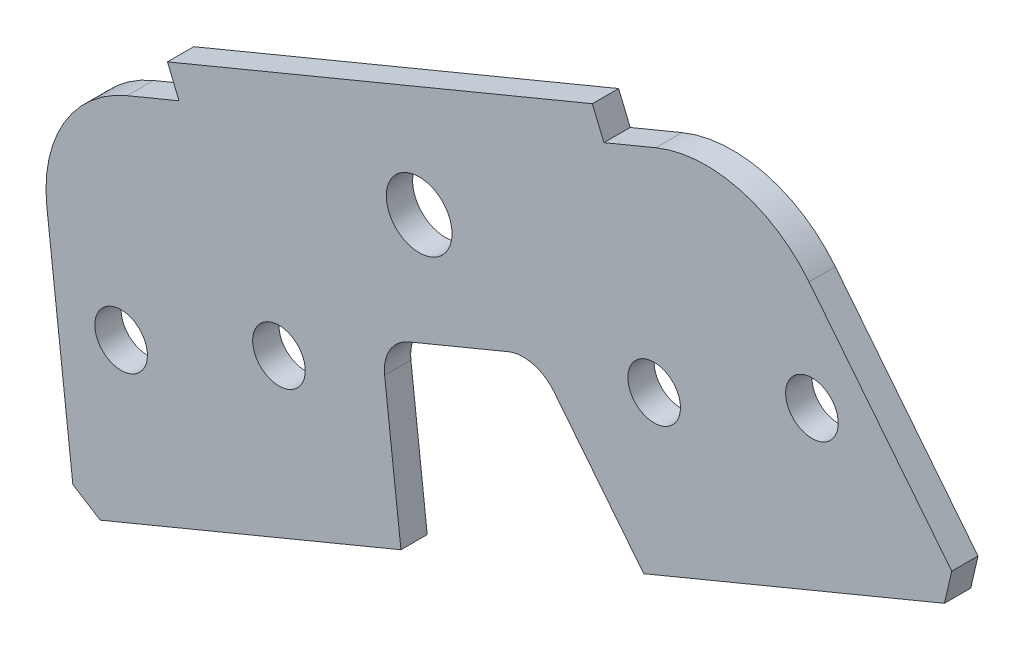
ISO-10303-21;
HEADER;
FILE_DESCRIPTION(('STEP AP214'),'2;1');
FILE_NAME('part.step','',(''),(''),'','','');
FILE_SCHEMA(('AUTOMOTIVE_DESIGN { 1 0 10303 214 1 1 1 1 }'));
ENDSEC;
DATA;
#1=APPLICATION_CONTEXT('core data for automotive mechanical design processes');
#2=APPLICATION_PROTOCOL_DEFINITION('international standard','automotive_design',2000,#1);
#3=PRODUCT_CONTEXT('',#1,'mechanical');
#4=PRODUCT('Part','Part','',(#3));
#5=PRODUCT_RELATED_PRODUCT_CATEGORY('part','',(#4));
#6=PRODUCT_DEFINITION_FORMATION('','',#4);
#7=PRODUCT_DEFINITION_CONTEXT('part definition',#1,'design');
#8=PRODUCT_DEFINITION('design','',#6,#7);
#9=PRODUCT_DEFINITION_SHAPE('','',#8);
#10=(LENGTH_UNIT() NAMED_UNIT(*) SI_UNIT(.MILLI.,.METRE.));
#11=(NAMED_UNIT(*) PLANE_ANGLE_UNIT() SI_UNIT($,.RADIAN.));
#12=(NAMED_UNIT(*) SI_UNIT($,.STERADIAN.) SOLID_ANGLE_UNIT());
#13=UNCERTAINTY_MEASURE_WITH_UNIT(LENGTH_MEASURE(1.E-05),#10,'distance_accuracy_value','');
#14=(GEOMETRIC_REPRESENTATION_CONTEXT(3) GLOBAL_UNCERTAINTY_ASSIGNED_CONTEXT((#13)) GLOBAL_UNIT_ASSIGNED_CONTEXT((#10,
#11,#12)) REPRESENTATION_CONTEXT('',''));
#15=CARTESIAN_POINT('',(0.,0.,0.));
#16=DIRECTION('',(0.,0.,1.));
#17=DIRECTION('',(1.,0.,0.));
#18=AXIS2_PLACEMENT_3D('',#15,#16,#17);
#19=CARTESIAN_POINT('',(0.,0.,0.));
#20=DIRECTION('',(0.,0.,1.));
#21=DIRECTION('',(1.,0.,0.));
#22=AXIS2_PLACEMENT_3D('',#19,#20,#21);
#23=PLANE('',#22);
#24=CARTESIAN_POINT('',(9.15052963955277,-2.4701754289237,0.));
#25=DIRECTION('',(0.,0.,1.));
#26=DIRECTION('',(1.,0.,0.));
#27=AXIS2_PLACEMENT_3D('',#24,#25,#26);
#28=CIRCLE('',#27,2.5);
#29=CARTESIAN_POINT('',(11.6505296395528,-2.4701754289237,0.));
#30=VERTEX_POINT('',#29);
#31=EDGE_CURVE('E339',#30,#30,#28,.T.);
#32=ORIENTED_EDGE('',*,*,#31,.T.);
#33=EDGE_LOOP('',(#32));
#34=FACE_BOUND('',#33,.T.);
#35=CARTESIAN_POINT('',(-1.51848160016179,-17.0846394614182,0.));
#36=DIRECTION('',(0.,0.,1.));
#37=DIRECTION('',(1.,0.,0.));
#38=AXIS2_PLACEMENT_3D('',#35,#36,#37);
#39=CIRCLE('',#38,2.);
#40=CARTESIAN_POINT('',(0.481518399838207,-17.0846394614182,0.));
#41=VERTEX_POINT('',#40);
#42=EDGE_CURVE('E322',#41,#41,#39,.T.);
#43=ORIENTED_EDGE('',*,*,#42,.T.);
#44=EDGE_LOOP('',(#43));
#45=FACE_BOUND('',#44,.T.);
#46=CARTESIAN_POINT('',(27.0308489094612,-5.24588121239051,0.));
#47=DIRECTION('',(0.,0.,1.));
#48=DIRECTION('',(1.,0.,0.));
#49=AXIS2_PLACEMENT_3D('',#46,#47,#48);
#50=CIRCLE('',#49,2.);
#51=CARTESIAN_POINT('',(29.0308489094612,-5.24588121239051,0.));
#52=VERTEX_POINT('',#51);
#53=EDGE_CURVE('E332',#52,#52,#50,.T.);
#54=ORIENTED_EDGE('',*,*,#53,.T.);
#55=EDGE_LOOP('',(#54));
#56=FACE_BOUND('',#55,.T.);
#57=CARTESIAN_POINT('',(39.039313186973,-0.266244107568475,0.));
#58=DIRECTION('',(0.,0.,1.));
#59=DIRECTION('',(1.,0.,0.));
#60=AXIS2_PLACEMENT_3D('',#57,#58,#59);
#61=CIRCLE('',#60,2.);
#62=CARTESIAN_POINT('',(41.039313186973,-0.266244107568475,0.));
#63=VERTEX_POINT('',#62);
#64=EDGE_CURVE('E231',#63,#63,#61,.T.);
#65=ORIENTED_EDGE('',*,*,#64,.T.);
#66=EDGE_LOOP('',(#65));
#67=FACE_BOUND('',#66,.T.);
#68=CARTESIAN_POINT('',(-13.5269458776737,-22.0642765662403,0.));
#69=DIRECTION('',(0.,0.,1.));
#70=DIRECTION('',(1.,0.,0.));
#71=AXIS2_PLACEMENT_3D('',#68,#69,#70);
#72=CIRCLE('',#71,2.);
#73=CARTESIAN_POINT('',(-11.5269458776737,-22.0642765662403,0.));
#74=VERTEX_POINT('',#73);
#75=EDGE_CURVE('E321',#74,#74,#72,.T.);
#76=ORIENTED_EDGE('',*,*,#75,.T.);
#77=EDGE_LOOP('',(#76));
#78=FACE_BOUND('',#77,.T.);
#79=DIRECTION('',(-0.113596389820193,0.993526980116705,0.));
#80=VECTOR('',#79,1.);
#81=CARTESIAN_POINT('',(7.76575409137843,-25.237089947171,0.));
#82=LINE('',#81,#80);
#83=CARTESIAN_POINT('',(7.76575409137843,-25.237089947171,0.));
#84=VERTEX_POINT('',#83);
#85=CARTESIAN_POINT('',(6.52174404513419,-14.3568362134367,0.));
#86=VERTEX_POINT('',#85);
#87=EDGE_CURVE('E61',#84,#86,#82,.T.);
#88=ORIENTED_EDGE('',*,*,#87,.F.);
#89=DIRECTION('',(0.923728021347068,0.383049008063238,0.));
#90=VECTOR('',#89,1.);
#91=CARTESIAN_POINT('',(-15.1143740140115,-34.7249588572736,0.));
#92=LINE('',#91,#90);
#93=CARTESIAN_POINT('',(-15.1143740140115,-34.7249588572736,0.));
#94=VERTEX_POINT('',#93);
#95=EDGE_CURVE('E224',#94,#84,#92,.T.);
#96=ORIENTED_EDGE('',*,*,#95,.F.);
#97=DIRECTION('',(0.848244236286053,-0.529605245071734,0.));
#98=VECTOR('',#97,1.);
#99=CARTESIAN_POINT('',(-17.1981785771974,-33.4239257595427,0.));
#100=LINE('',#99,#98);
#101=CARTESIAN_POINT('',(-17.1981785771974,-33.4239257595427,0.));
#102=VERTEX_POINT('',#101);
#103=EDGE_CURVE('E221',#102,#94,#100,.T.);
#104=ORIENTED_EDGE('',*,*,#103,.F.);
#105=DIRECTION('',(0.113596389820181,-0.993526980116706,0.));
#106=VECTOR('',#105,1.);
#107=CARTESIAN_POINT('',(-19.1783506268372,-16.1051151907874,0.));
#108=LINE('',#107,#106);
#109=CARTESIAN_POINT('',(-19.1783506268372,-16.1051151907874,0.));
#110=VERTEX_POINT('',#109);
#111=EDGE_CURVE('E218',#110,#102,#108,.T.);
#112=ORIENTED_EDGE('',*,*,#111,.F.);
#113=CARTESIAN_POINT('',(-9.24308082567015,-14.9691512925857,0.));
#114=DIRECTION('',(0.,0.,1.));
#115=DIRECTION('',(1.,0.,0.));
#116=AXIS2_PLACEMENT_3D('',#113,#114,#115);
#117=CIRCLE('',#116,10.);
#118=CARTESIAN_POINT('',(-13.0735709063025,-5.73187107911496,0.));
#119=VERTEX_POINT('',#118);
#120=EDGE_CURVE('E215',#119,#110,#117,.T.);
#121=ORIENTED_EDGE('',*,*,#120,.F.);
#122=DIRECTION('',(-0.923728021347069,-0.383049008063236,0.));
#123=VECTOR('',#122,1.);
#124=CARTESIAN_POINT('',(-9.12148027836872,-4.09302895262147,0.));
#125=LINE('',#124,#123);
#126=CARTESIAN_POINT('',(-9.12148027836872,-4.09302895262147,0.));
#127=VERTEX_POINT('',#126);
#128=EDGE_CURVE('E212',#127,#119,#125,.T.);
#129=ORIENTED_EDGE('',*,*,#128,.F.);
#130=DIRECTION('',(0.383049008063239,-0.923728021347068,0.));
#131=VECTOR('',#130,1.);
#132=CARTESIAN_POINT('',(-10.0024929969142,-1.96845450352322,0.));
#133=LINE('',#132,#131);
#134=CARTESIAN_POINT('',(-10.0024929969142,-1.96845450352322,0.));
#135=VERTEX_POINT('',#134);
#136=EDGE_CURVE('E209',#135,#127,#133,.T.);
#137=ORIENTED_EDGE('',*,*,#136,.F.);
#138=DIRECTION('',(-0.923728021347068,-0.383049008063238,0.));
#139=VECTOR('',#138,1.);
#140=CARTESIAN_POINT('',(22.3279877502332,11.4382607786901,0.));
#141=LINE('',#140,#139);
#142=CARTESIAN_POINT('',(22.3279877502332,11.4382607786901,0.));
#143=VERTEX_POINT('',#142);
#144=EDGE_CURVE('E206',#143,#135,#141,.T.);
#145=ORIENTED_EDGE('',*,*,#144,.F.);
#146=DIRECTION('',(-0.383049008063237,0.923728021347069,0.));
#147=VECTOR('',#146,1.);
#148=CARTESIAN_POINT('',(23.2090004687787,9.31368632959184,0.));
#149=LINE('',#148,#147);
#150=CARTESIAN_POINT('',(23.2090004687787,9.31368632959184,0.));
#151=VERTEX_POINT('',#150);
#152=EDGE_CURVE('E203',#151,#143,#149,.T.);
#153=ORIENTED_EDGE('',*,*,#152,.F.);
#154=DIRECTION('',(-0.923728021347067,-0.38304900806324,0.));
#155=VECTOR('',#154,1.);
#156=CARTESIAN_POINT('',(27.1610910967124,10.9525284560853,0.));
#157=LINE('',#156,#155);
#158=CARTESIAN_POINT('',(27.1610910967124,10.9525284560853,0.));
#159=VERTEX_POINT('',#158);
#160=EDGE_CURVE('E200',#159,#151,#157,.T.);
#161=ORIENTED_EDGE('',*,*,#160,.F.);
#162=CARTESIAN_POINT('',(30.9915811773447,1.71524824261463,0.));
#163=DIRECTION('',(0.,0.,1.));
#164=DIRECTION('',(1.,0.,0.));
#165=AXIS2_PLACEMENT_3D('',#162,#163,#164);
#166=CIRCLE('',#165,10.);
#167=CARTESIAN_POINT('',(38.8151986638943,7.94349112677999,0.));
#168=VERTEX_POINT('',#167);
#169=EDGE_CURVE('E197',#168,#159,#166,.T.);
#170=ORIENTED_EDGE('',*,*,#169,.F.);
#171=DIRECTION('',(-0.622824288416537,0.782361748654952,0.));
#172=VECTOR('',#171,1.);
#173=CARTESIAN_POINT('',(49.6720511546426,-5.69436188814628,0.));
#174=LINE('',#173,#172);
#175=CARTESIAN_POINT('',(49.6720511546426,-5.69436188814628,0.));
#176=VERTEX_POINT('',#175);
#177=EDGE_CURVE('E194',#176,#168,#174,.T.);
#178=ORIENTED_EDGE('',*,*,#177,.F.);
#179=DIRECTION('',(0.224540614468517,0.974464731252035,0.));
#180=VECTOR('',#179,1.);
#181=CARTESIAN_POINT('',(49.1204426237097,-8.08824087580364,0.));
#182=LINE('',#181,#180);
#183=CARTESIAN_POINT('',(49.1204426237097,-8.08824087580364,0.));
#184=VERTEX_POINT('',#183);
#185=EDGE_CURVE('E191',#184,#176,#182,.T.);
#186=ORIENTED_EDGE('',*,*,#185,.F.);
#187=DIRECTION('',(0.923728021347068,0.383049008063238,0.));
#188=VECTOR('',#187,1.);
#189=CARTESIAN_POINT('',(26.2403145183198,-17.5761097859062,0.));
#190=LINE('',#189,#188);
#191=CARTESIAN_POINT('',(26.2403145183198,-17.5761097859062,0.));
#192=VERTEX_POINT('',#191);
#193=EDGE_CURVE('E185',#192,#184,#190,.T.);
#194=ORIENTED_EDGE('',*,*,#193,.F.);
#195=DIRECTION('',(0.622824288416526,-0.782361748654961,0.));
#196=VECTOR('',#195,1.);
#197=CARTESIAN_POINT('',(19.419678113752,-9.00835620971839,0.));
#198=LINE('',#197,#196);
#199=CARTESIAN_POINT('',(19.419678113752,-9.00835620971839,0.));
#200=VERTEX_POINT('',#199);
#201=EDGE_CURVE('E183',#200,#192,#198,.T.);
#202=ORIENTED_EDGE('',*,*,#201,.F.);
#203=CARTESIAN_POINT('',(17.0725928677871,-10.876829074968,0.));
#204=DIRECTION('',(0.,0.,-1.));
#205=DIRECTION('',(1.,0.,0.));
#206=AXIS2_PLACEMENT_3D('',#203,#204,#205);
#207=CIRCLE('',#206,3.);
#208=CARTESIAN_POINT('',(15.9234458435974,-8.10564501092676,0.));
#209=VERTEX_POINT('',#208);
#210=EDGE_CURVE('E166',#209,#200,#207,.T.);
#211=ORIENTED_EDGE('',*,*,#210,.F.);
#212=DIRECTION('',(0.923728021347068,0.383049008063238,0.));
#213=VECTOR('',#212,1.);
#214=CARTESIAN_POINT('',(8.3531779612946,-11.2448629799349,0.));
#215=LINE('',#214,#213);
#216=CARTESIAN_POINT('',(8.3531779612946,-11.2448629799349,0.));
#217=VERTEX_POINT('',#216);
#218=EDGE_CURVE('E174',#217,#209,#215,.T.);
#219=ORIENTED_EDGE('',*,*,#218,.F.);
#220=CARTESIAN_POINT('',(9.5023249854843,-14.0160470439761,0.));
#221=DIRECTION('',(0.,0.,-1.));
#222=DIRECTION('',(1.,0.,0.));
#223=AXIS2_PLACEMENT_3D('',#220,#221,#222);
#224=CIRCLE('',#223,3.);
#225=EDGE_CURVE('E179',#86,#217,#224,.T.);
#226=ORIENTED_EDGE('',*,*,#225,.F.);
#227=EDGE_LOOP('',(#88,#96,#104,#112,#121,#129,#137,#145,#153,#161,#170,#178,#186,#194,#202,
#211,#219,#226));
#228=FACE_BOUND('',#227,.T.);
#229=ADVANCED_FACE('F37',(#34,#45,#56,#67,#78,#228),#23,.F.);
#230=CARTESIAN_POINT('',(7.76575409137843,-25.237089947171,0.));
#231=DIRECTION('',(0.993526980116705,0.113596389820193,0.));
#232=DIRECTION('',(-0.113596389820193,0.993526980116705,0.));
#233=AXIS2_PLACEMENT_3D('',#230,#231,#232);
#234=PLANE('',#233);
#235=DIRECTION('',(-0.113596389820193,0.993526980116705,0.));
#236=VECTOR('',#235,1.);
#237=CARTESIAN_POINT('',(7.76575409137843,-25.237089947171,2.));
#238=LINE('',#237,#236);
#239=CARTESIAN_POINT('',(7.76575409137843,-25.237089947171,2.));
#240=VERTEX_POINT('',#239);
#241=CARTESIAN_POINT('',(6.52174404513419,-14.3568362134367,2.));
#242=VERTEX_POINT('',#241);
#243=EDGE_CURVE('E227',#240,#242,#238,.T.);
#244=ORIENTED_EDGE('',*,*,#243,.F.);
#245=DIRECTION('',(0.,0.,1.));
#246=VECTOR('',#245,1.);
#247=CARTESIAN_POINT('',(7.76575409137843,-25.237089947171,0.));
#248=LINE('',#247,#246);
#249=EDGE_CURVE('E12',#84,#240,#248,.T.);
#250=ORIENTED_EDGE('',*,*,#249,.F.);
#251=ORIENTED_EDGE('',*,*,#87,.T.);
#252=DIRECTION('',(0.,0.,1.));
#253=VECTOR('',#252,1.);
#254=CARTESIAN_POINT('',(6.52174404513418,-14.3568362134367,0.));
#255=LINE('',#254,#253);
#256=EDGE_CURVE('E40',#86,#242,#255,.T.);
#257=ORIENTED_EDGE('',*,*,#256,.T.);
#258=EDGE_LOOP('',(#244,#250,#251,#257));
#259=FACE_BOUND('',#258,.T.);
#260=ADVANCED_FACE('F306',(#259),#234,.T.);
#261=CARTESIAN_POINT('',(-15.1143740140115,-34.7249588572736,0.));
#262=DIRECTION('',(0.383049008063238,-0.923728021347068,0.));
#263=DIRECTION('',(0.923728021347068,0.383049008063238,0.));
#264=AXIS2_PLACEMENT_3D('',#261,#262,#263);
#265=PLANE('',#264);
#266=DIRECTION('',(0.923728021347068,0.383049008063238,0.));
#267=VECTOR('',#266,1.);
#268=CARTESIAN_POINT('',(-15.1143740140115,-34.7249588572736,2.));
#269=LINE('',#268,#267);
#270=CARTESIAN_POINT('',(-15.1143740140115,-34.7249588572736,2.));
#271=VERTEX_POINT('',#270);
#272=EDGE_CURVE('E275',#271,#240,#269,.T.);
#273=ORIENTED_EDGE('',*,*,#272,.F.);
#274=DIRECTION('',(0.,0.,1.));
#275=VECTOR('',#274,1.);
#276=CARTESIAN_POINT('',(-15.1143740140115,-34.7249588572736,0.));
#277=LINE('',#276,#275);
#278=EDGE_CURVE('E45',#94,#271,#277,.T.);
#279=ORIENTED_EDGE('',*,*,#278,.F.);
#280=ORIENTED_EDGE('',*,*,#95,.T.);
#281=ORIENTED_EDGE('',*,*,#249,.T.);
#282=EDGE_LOOP('',(#273,#279,#280,#281));
#283=FACE_BOUND('',#282,.T.);
#284=ADVANCED_FACE('F313',(#283),#265,.T.);
#285=CARTESIAN_POINT('',(-17.1981785771974,-33.4239257595427,0.));
#286=DIRECTION('',(-0.529605245071734,-0.848244236286053,0.));
#287=DIRECTION('',(0.848244236286053,-0.529605245071734,0.));
#288=AXIS2_PLACEMENT_3D('',#285,#286,#287);
#289=PLANE('',#288);
#290=DIRECTION('',(0.848244236286053,-0.529605245071734,0.));
#291=VECTOR('',#290,1.);
#292=CARTESIAN_POINT('',(-17.1981785771974,-33.4239257595427,2.));
#293=LINE('',#292,#291);
#294=CARTESIAN_POINT('',(-17.1981785771974,-33.4239257595427,2.));
#295=VERTEX_POINT('',#294);
#296=EDGE_CURVE('E272',#295,#271,#293,.T.);
#297=ORIENTED_EDGE('',*,*,#296,.F.);
#298=DIRECTION('',(0.,0.,1.));
#299=VECTOR('',#298,1.);
#300=CARTESIAN_POINT('',(-17.1981785771974,-33.4239257595427,0.));
#301=LINE('',#300,#299);
#302=EDGE_CURVE('E279',#102,#295,#301,.T.);
#303=ORIENTED_EDGE('',*,*,#302,.F.);
#304=ORIENTED_EDGE('',*,*,#103,.T.);
#305=ORIENTED_EDGE('',*,*,#278,.T.);
#306=EDGE_LOOP('',(#297,#303,#304,#305));
#307=FACE_BOUND('',#306,.T.);
#308=ADVANCED_FACE('F536',(#307),#289,.T.);
#309=CARTESIAN_POINT('',(-19.1783506268372,-16.1051151907874,0.));
#310=DIRECTION('',(-0.993526980116706,-0.113596389820181,0.));
#311=DIRECTION('',(0.113596389820181,-0.993526980116706,0.));
#312=AXIS2_PLACEMENT_3D('',#309,#310,#311);
#313=PLANE('',#312);
#314=DIRECTION('',(0.113596389820181,-0.993526980116706,0.));
#315=VECTOR('',#314,1.);
#316=CARTESIAN_POINT('',(-19.1783506268372,-16.1051151907874,2.));
#317=LINE('',#316,#315);
#318=CARTESIAN_POINT('',(-19.1783506268372,-16.1051151907874,2.));
#319=VERTEX_POINT('',#318);
#320=EDGE_CURVE('E269',#319,#295,#317,.T.);
#321=ORIENTED_EDGE('',*,*,#320,.F.);
#322=DIRECTION('',(0.,0.,1.));
#323=VECTOR('',#322,1.);
#324=CARTESIAN_POINT('',(-19.1783506268372,-16.1051151907874,0.));
#325=LINE('',#324,#323);
#326=EDGE_CURVE('E281',#110,#319,#325,.T.);
#327=ORIENTED_EDGE('',*,*,#326,.F.);
#328=ORIENTED_EDGE('',*,*,#111,.T.);
#329=ORIENTED_EDGE('',*,*,#302,.T.);
#330=EDGE_LOOP('',(#321,#327,#328,#329));
#331=FACE_BOUND('',#330,.T.);
#332=ADVANCED_FACE('F528',(#331),#313,.T.);
#333=CARTESIAN_POINT('',(-9.24308082567015,-14.9691512925857,0.));
#334=DIRECTION('',(0.,0.,1.));
#335=DIRECTION('',(1.,0.,0.));
#336=AXIS2_PLACEMENT_3D('',#333,#334,#335);
#337=CYLINDRICAL_SURFACE('',#336,10.);
#338=CARTESIAN_POINT('',(-9.24308082567015,-14.9691512925857,2.));
#339=DIRECTION('',(0.,0.,1.));
#340=DIRECTION('',(1.,0.,0.));
#341=AXIS2_PLACEMENT_3D('',#338,#339,#340);
#342=CIRCLE('',#341,10.);
#343=CARTESIAN_POINT('',(-13.0735709063025,-5.73187107911496,2.));
#344=VERTEX_POINT('',#343);
#345=EDGE_CURVE('E266',#344,#319,#342,.T.);
#346=ORIENTED_EDGE('',*,*,#345,.F.);
#347=DIRECTION('',(0.,0.,1.));
#348=VECTOR('',#347,1.);
#349=CARTESIAN_POINT('',(-13.0735709063025,-5.73187107911496,0.));
#350=LINE('',#349,#348);
#351=EDGE_CURVE('E283',#119,#344,#350,.T.);
#352=ORIENTED_EDGE('',*,*,#351,.F.);
#353=ORIENTED_EDGE('',*,*,#120,.T.);
#354=ORIENTED_EDGE('',*,*,#326,.T.);
#355=EDGE_LOOP('',(#346,#352,#353,#354));
#356=FACE_BOUND('',#355,.T.);
#357=ADVANCED_FACE('F520',(#356),#337,.T.);
#358=CARTESIAN_POINT('',(-9.12148027836872,-4.09302895262147,0.));
#359=DIRECTION('',(-0.383049008063236,0.923728021347069,0.));
#360=DIRECTION('',(-0.923728021347069,-0.383049008063236,0.));
#361=AXIS2_PLACEMENT_3D('',#358,#359,#360);
#362=PLANE('',#361);
#363=DIRECTION('',(-0.923728021347069,-0.383049008063236,0.));
#364=VECTOR('',#363,1.);
#365=CARTESIAN_POINT('',(-9.12148027836872,-4.09302895262147,2.));
#366=LINE('',#365,#364);
#367=CARTESIAN_POINT('',(-9.12148027836872,-4.09302895262147,2.));
#368=VERTEX_POINT('',#367);
#369=EDGE_CURVE('E263',#368,#344,#366,.T.);
#370=ORIENTED_EDGE('',*,*,#369,.F.);
#371=DIRECTION('',(0.,0.,1.));
#372=VECTOR('',#371,1.);
#373=CARTESIAN_POINT('',(-9.12148027836872,-4.09302895262147,0.));
#374=LINE('',#373,#372);
#375=EDGE_CURVE('E285',#127,#368,#374,.T.);
#376=ORIENTED_EDGE('',*,*,#375,.F.);
#377=ORIENTED_EDGE('',*,*,#128,.T.);
#378=ORIENTED_EDGE('',*,*,#351,.T.);
#379=EDGE_LOOP('',(#370,#376,#377,#378));
#380=FACE_BOUND('',#379,.T.);
#381=ADVANCED_FACE('F512',(#380),#362,.T.);
#382=CARTESIAN_POINT('',(-10.0024929969142,-1.96845450352322,0.));
#383=DIRECTION('',(-0.923728021347068,-0.383049008063239,0.));
#384=DIRECTION('',(0.383049008063239,-0.923728021347068,0.));
#385=AXIS2_PLACEMENT_3D('',#382,#383,#384);
#386=PLANE('',#385);
#387=DIRECTION('',(0.383049008063239,-0.923728021347068,0.));
#388=VECTOR('',#387,1.);
#389=CARTESIAN_POINT('',(-10.0024929969142,-1.96845450352322,2.));
#390=LINE('',#389,#388);
#391=CARTESIAN_POINT('',(-10.0024929969142,-1.96845450352322,2.));
#392=VERTEX_POINT('',#391);
#393=EDGE_CURVE('E260',#392,#368,#390,.T.);
#394=ORIENTED_EDGE('',*,*,#393,.F.);
#395=DIRECTION('',(0.,0.,1.));
#396=VECTOR('',#395,1.);
#397=CARTESIAN_POINT('',(-10.0024929969142,-1.96845450352322,0.));
#398=LINE('',#397,#396);
#399=EDGE_CURVE('E287',#135,#392,#398,.T.);
#400=ORIENTED_EDGE('',*,*,#399,.F.);
#401=ORIENTED_EDGE('',*,*,#136,.T.);
#402=ORIENTED_EDGE('',*,*,#375,.T.);
#403=EDGE_LOOP('',(#394,#400,#401,#402));
#404=FACE_BOUND('',#403,.T.);
#405=ADVANCED_FACE('F504',(#404),#386,.T.);
#406=CARTESIAN_POINT('',(22.3279877502332,11.4382607786901,0.));
#407=DIRECTION('',(-0.383049008063238,0.923728021347068,0.));
#408=DIRECTION('',(-0.923728021347068,-0.383049008063238,0.));
#409=AXIS2_PLACEMENT_3D('',#406,#407,#408);
#410=PLANE('',#409);
#411=DIRECTION('',(-0.923728021347068,-0.383049008063238,0.));
#412=VECTOR('',#411,1.);
#413=CARTESIAN_POINT('',(22.3279877502332,11.4382607786901,2.));
#414=LINE('',#413,#412);
#415=CARTESIAN_POINT('',(22.3279877502332,11.4382607786901,2.));
#416=VERTEX_POINT('',#415);
#417=EDGE_CURVE('E257',#416,#392,#414,.T.);
#418=ORIENTED_EDGE('',*,*,#417,.F.);
#419=DIRECTION('',(0.,0.,1.));
#420=VECTOR('',#419,1.);
#421=CARTESIAN_POINT('',(22.3279877502332,11.4382607786901,0.));
#422=LINE('',#421,#420);
#423=EDGE_CURVE('E289',#143,#416,#422,.T.);
#424=ORIENTED_EDGE('',*,*,#423,.F.);
#425=ORIENTED_EDGE('',*,*,#144,.T.);
#426=ORIENTED_EDGE('',*,*,#399,.T.);
#427=EDGE_LOOP('',(#418,#424,#425,#426));
#428=FACE_BOUND('',#427,.T.);
#429=ADVANCED_FACE('F496',(#428),#410,.T.);
#430=CARTESIAN_POINT('',(23.2090004687787,9.31368632959184,0.));
#431=DIRECTION('',(0.923728021347069,0.383049008063237,0.));
#432=DIRECTION('',(-0.383049008063237,0.923728021347068,0.));
#433=AXIS2_PLACEMENT_3D('',#430,#431,#432);
#434=PLANE('',#433);
#435=DIRECTION('',(-0.383049008063237,0.923728021347069,0.));
#436=VECTOR('',#435,1.);
#437=CARTESIAN_POINT('',(23.2090004687787,9.31368632959184,2.));
#438=LINE('',#437,#436);
#439=CARTESIAN_POINT('',(23.2090004687787,9.31368632959184,2.));
#440=VERTEX_POINT('',#439);
#441=EDGE_CURVE('E254',#440,#416,#438,.T.);
#442=ORIENTED_EDGE('',*,*,#441,.F.);
#443=DIRECTION('',(0.,0.,1.));
#444=VECTOR('',#443,1.);
#445=CARTESIAN_POINT('',(23.2090004687787,9.31368632959184,0.));
#446=LINE('',#445,#444);
#447=EDGE_CURVE('E291',#151,#440,#446,.T.);
#448=ORIENTED_EDGE('',*,*,#447,.F.);
#449=ORIENTED_EDGE('',*,*,#152,.T.);
#450=ORIENTED_EDGE('',*,*,#423,.T.);
#451=EDGE_LOOP('',(#442,#448,#449,#450));
#452=FACE_BOUND('',#451,.T.);
#453=ADVANCED_FACE('F488',(#452),#434,.T.);
#454=CARTESIAN_POINT('',(27.1610910967124,10.9525284560853,0.));
#455=DIRECTION('',(-0.38304900806324,0.923728021347067,0.));
#456=DIRECTION('',(-0.923728021347067,-0.38304900806324,0.));
#457=AXIS2_PLACEMENT_3D('',#454,#455,#456);
#458=PLANE('',#457);
#459=DIRECTION('',(-0.923728021347067,-0.38304900806324,0.));
#460=VECTOR('',#459,1.);
#461=CARTESIAN_POINT('',(27.1610910967124,10.9525284560853,2.));
#462=LINE('',#461,#460);
#463=CARTESIAN_POINT('',(27.1610910967124,10.9525284560853,2.));
#464=VERTEX_POINT('',#463);
#465=EDGE_CURVE('E251',#464,#440,#462,.T.);
#466=ORIENTED_EDGE('',*,*,#465,.F.);
#467=DIRECTION('',(0.,0.,1.));
#468=VECTOR('',#467,1.);
#469=CARTESIAN_POINT('',(27.1610910967124,10.9525284560853,0.));
#470=LINE('',#469,#468);
#471=EDGE_CURVE('E293',#159,#464,#470,.T.);
#472=ORIENTED_EDGE('',*,*,#471,.F.);
#473=ORIENTED_EDGE('',*,*,#160,.T.);
#474=ORIENTED_EDGE('',*,*,#447,.T.);
#475=EDGE_LOOP('',(#466,#472,#473,#474));
#476=FACE_BOUND('',#475,.T.);
#477=ADVANCED_FACE('F480',(#476),#458,.T.);
#478=CARTESIAN_POINT('',(30.9915811773447,1.71524824261463,0.));
#479=DIRECTION('',(0.,0.,1.));
#480=DIRECTION('',(1.,0.,0.));
#481=AXIS2_PLACEMENT_3D('',#478,#479,#480);
#482=CYLINDRICAL_SURFACE('',#481,10.);
#483=CARTESIAN_POINT('',(30.9915811773447,1.71524824261463,2.));
#484=DIRECTION('',(0.,0.,1.));
#485=DIRECTION('',(1.,0.,0.));
#486=AXIS2_PLACEMENT_3D('',#483,#484,#485);
#487=CIRCLE('',#486,10.);
#488=CARTESIAN_POINT('',(38.8151986638943,7.94349112677999,2.));
#489=VERTEX_POINT('',#488);
#490=EDGE_CURVE('E248',#489,#464,#487,.T.);
#491=ORIENTED_EDGE('',*,*,#490,.F.);
#492=DIRECTION('',(0.,0.,1.));
#493=VECTOR('',#492,1.);
#494=CARTESIAN_POINT('',(38.8151986638943,7.94349112677999,0.));
#495=LINE('',#494,#493);
#496=EDGE_CURVE('E295',#168,#489,#495,.T.);
#497=ORIENTED_EDGE('',*,*,#496,.F.);
#498=ORIENTED_EDGE('',*,*,#169,.T.);
#499=ORIENTED_EDGE('',*,*,#471,.T.);
#500=EDGE_LOOP('',(#491,#497,#498,#499));
#501=FACE_BOUND('',#500,.T.);
#502=ADVANCED_FACE('F472',(#501),#482,.T.);
#503=CARTESIAN_POINT('',(49.6720511546426,-5.69436188814628,0.));
#504=DIRECTION('',(0.782361748654952,0.622824288416537,0.));
#505=DIRECTION('',(-0.622824288416537,0.782361748654952,0.));
#506=AXIS2_PLACEMENT_3D('',#503,#504,#505);
#507=PLANE('',#506);
#508=DIRECTION('',(-0.622824288416537,0.782361748654952,0.));
#509=VECTOR('',#508,1.);
#510=CARTESIAN_POINT('',(49.6720511546426,-5.69436188814628,2.));
#511=LINE('',#510,#509);
#512=CARTESIAN_POINT('',(49.6720511546426,-5.69436188814628,2.));
#513=VERTEX_POINT('',#512);
#514=EDGE_CURVE('E245',#513,#489,#511,.T.);
#515=ORIENTED_EDGE('',*,*,#514,.F.);
#516=DIRECTION('',(0.,0.,1.));
#517=VECTOR('',#516,1.);
#518=CARTESIAN_POINT('',(49.6720511546426,-5.69436188814628,0.));
#519=LINE('',#518,#517);
#520=EDGE_CURVE('E297',#176,#513,#519,.T.);
#521=ORIENTED_EDGE('',*,*,#520,.F.);
#522=ORIENTED_EDGE('',*,*,#177,.T.);
#523=ORIENTED_EDGE('',*,*,#496,.T.);
#524=EDGE_LOOP('',(#515,#521,#522,#523));
#525=FACE_BOUND('',#524,.T.);
#526=ADVANCED_FACE('F464',(#525),#507,.T.);
#527=CARTESIAN_POINT('',(49.1204426237097,-8.08824087580364,0.));
#528=DIRECTION('',(0.974464731252035,-0.224540614468517,0.));
#529=DIRECTION('',(0.224540614468517,0.974464731252035,0.));
#530=AXIS2_PLACEMENT_3D('',#527,#528,#529);
#531=PLANE('',#530);
#532=DIRECTION('',(0.224540614468517,0.974464731252035,0.));
#533=VECTOR('',#532,1.);
#534=CARTESIAN_POINT('',(49.1204426237097,-8.08824087580364,2.));
#535=LINE('',#534,#533);
#536=CARTESIAN_POINT('',(49.1204426237097,-8.08824087580364,2.));
#537=VERTEX_POINT('',#536);
#538=EDGE_CURVE('E242',#537,#513,#535,.T.);
#539=ORIENTED_EDGE('',*,*,#538,.F.);
#540=DIRECTION('',(0.,0.,1.));
#541=VECTOR('',#540,1.);
#542=CARTESIAN_POINT('',(49.1204426237097,-8.08824087580364,0.));
#543=LINE('',#542,#541);
#544=EDGE_CURVE('E299',#184,#537,#543,.T.);
#545=ORIENTED_EDGE('',*,*,#544,.F.);
#546=ORIENTED_EDGE('',*,*,#185,.T.);
#547=ORIENTED_EDGE('',*,*,#520,.T.);
#548=EDGE_LOOP('',(#539,#545,#546,#547));
#549=FACE_BOUND('',#548,.T.);
#550=ADVANCED_FACE('F456',(#549),#531,.T.);
#551=CARTESIAN_POINT('',(26.2403145183198,-17.5761097859062,0.));
#552=DIRECTION('',(0.383049008063238,-0.923728021347068,0.));
#553=DIRECTION('',(0.923728021347068,0.383049008063238,0.));
#554=AXIS2_PLACEMENT_3D('',#551,#552,#553);
#555=PLANE('',#554);
#556=DIRECTION('',(0.923728021347068,0.383049008063238,0.));
#557=VECTOR('',#556,1.);
#558=CARTESIAN_POINT('',(26.2403145183198,-17.5761097859062,2.));
#559=LINE('',#558,#557);
#560=CARTESIAN_POINT('',(26.2403145183198,-17.5761097859062,2.));
#561=VERTEX_POINT('',#560);
#562=EDGE_CURVE('E239',#561,#537,#559,.T.);
#563=ORIENTED_EDGE('',*,*,#562,.F.);
#564=DIRECTION('',(0.,0.,1.));
#565=VECTOR('',#564,1.);
#566=CARTESIAN_POINT('',(26.2403145183198,-17.5761097859062,0.));
#567=LINE('',#566,#565);
#568=EDGE_CURVE('E301',#192,#561,#567,.T.);
#569=ORIENTED_EDGE('',*,*,#568,.F.);
#570=ORIENTED_EDGE('',*,*,#193,.T.);
#571=ORIENTED_EDGE('',*,*,#544,.T.);
#572=EDGE_LOOP('',(#563,#569,#570,#571));
#573=FACE_BOUND('',#572,.T.);
#574=ADVANCED_FACE('F448',(#573),#555,.T.);
#575=CARTESIAN_POINT('',(19.419678113752,-9.00835620971839,0.));
#576=DIRECTION('',(-0.782361748654961,-0.622824288416526,0.));
#577=DIRECTION('',(0.622824288416526,-0.782361748654961,0.));
#578=AXIS2_PLACEMENT_3D('',#575,#576,#577);
#579=PLANE('',#578);
#580=DIRECTION('',(0.622824288416526,-0.782361748654961,0.));
#581=VECTOR('',#580,1.);
#582=CARTESIAN_POINT('',(19.419678113752,-9.00835620971839,2.));
#583=LINE('',#582,#581);
#584=CARTESIAN_POINT('',(19.419678113752,-9.00835620971839,2.));
#585=VERTEX_POINT('',#584);
#586=EDGE_CURVE('E236',#585,#561,#583,.T.);
#587=ORIENTED_EDGE('',*,*,#586,.F.);
#588=DIRECTION('',(0.,0.,1.));
#589=VECTOR('',#588,1.);
#590=CARTESIAN_POINT('',(19.419678113752,-9.00835620971839,0.));
#591=LINE('',#590,#589);
#592=EDGE_CURVE('E170',#200,#585,#591,.T.);
#593=ORIENTED_EDGE('',*,*,#592,.F.);
#594=ORIENTED_EDGE('',*,*,#201,.T.);
#595=ORIENTED_EDGE('',*,*,#568,.T.);
#596=EDGE_LOOP('',(#587,#593,#594,#595));
#597=FACE_BOUND('',#596,.T.);
#598=ADVANCED_FACE('F441',(#597),#579,.T.);
#599=CARTESIAN_POINT('',(17.0725928677871,-10.876829074968,0.));
#600=DIRECTION('',(0.,0.,1.));
#601=DIRECTION('',(1.,0.,0.));
#602=AXIS2_PLACEMENT_3D('',#599,#600,#601);
#603=CYLINDRICAL_SURFACE('',#602,3.);
#604=CARTESIAN_POINT('',(17.0725928677871,-10.876829074968,2.));
#605=DIRECTION('',(0.,0.,-1.));
#606=DIRECTION('',(1.,0.,0.));
#607=AXIS2_PLACEMENT_3D('',#604,#605,#606);
#608=CIRCLE('',#607,3.);
#609=CARTESIAN_POINT('',(15.9234458435974,-8.10564501092676,2.));
#610=VERTEX_POINT('',#609);
#611=EDGE_CURVE('E169',#610,#585,#608,.T.);
#612=ORIENTED_EDGE('',*,*,#611,.F.);
#613=DIRECTION('',(0.,0.,1.));
#614=VECTOR('',#613,1.);
#615=CARTESIAN_POINT('',(15.9234458435974,-8.10564501092676,0.));
#616=LINE('',#615,#614);
#617=EDGE_CURVE('E162',#209,#610,#616,.T.);
#618=ORIENTED_EDGE('',*,*,#617,.F.);
#619=ORIENTED_EDGE('',*,*,#210,.T.);
#620=ORIENTED_EDGE('',*,*,#592,.T.);
#621=EDGE_LOOP('',(#612,#618,#619,#620));
#622=FACE_BOUND('',#621,.T.);
#623=ADVANCED_FACE('F164',(#622),#603,.F.);
#624=CARTESIAN_POINT('',(8.3531779612946,-11.2448629799349,0.));
#625=DIRECTION('',(0.383049008063238,-0.923728021347068,0.));
#626=DIRECTION('',(0.923728021347068,0.383049008063238,0.));
#627=AXIS2_PLACEMENT_3D('',#624,#625,#626);
#628=PLANE('',#627);
#629=DIRECTION('',(0.923728021347068,0.383049008063238,0.));
#630=VECTOR('',#629,1.);
#631=CARTESIAN_POINT('',(8.3531779612946,-11.2448629799349,2.));
#632=LINE('',#631,#630);
#633=CARTESIAN_POINT('',(8.3531779612946,-11.2448629799349,2.));
#634=VERTEX_POINT('',#633);
#635=EDGE_CURVE('E53',#634,#610,#632,.T.);
#636=ORIENTED_EDGE('',*,*,#635,.F.);
#637=DIRECTION('',(0.,0.,1.));
#638=VECTOR('',#637,1.);
#639=CARTESIAN_POINT('',(8.3531779612946,-11.2448629799349,0.));
#640=LINE('',#639,#638);
#641=EDGE_CURVE('E171',#217,#634,#640,.T.);
#642=ORIENTED_EDGE('',*,*,#641,.F.);
#643=ORIENTED_EDGE('',*,*,#218,.T.);
#644=ORIENTED_EDGE('',*,*,#617,.T.);
#645=EDGE_LOOP('',(#636,#642,#643,#644));
#646=FACE_BOUND('',#645,.T.);
#647=ADVANCED_FACE('F175',(#646),#628,.T.);
#648=CARTESIAN_POINT('',(9.5023249854843,-14.0160470439761,0.));
#649=DIRECTION('',(0.,0.,1.));
#650=DIRECTION('',(1.,0.,0.));
#651=AXIS2_PLACEMENT_3D('',#648,#649,#650);
#652=CYLINDRICAL_SURFACE('',#651,3.);
#653=CARTESIAN_POINT('',(9.5023249854843,-14.0160470439761,2.));
#654=DIRECTION('',(0.,0.,-1.));
#655=DIRECTION('',(1.,0.,0.));
#656=AXIS2_PLACEMENT_3D('',#653,#654,#655);
#657=CIRCLE('',#656,3.);
#658=EDGE_CURVE('E230',#242,#634,#657,.T.);
#659=ORIENTED_EDGE('',*,*,#658,.F.);
#660=ORIENTED_EDGE('',*,*,#256,.F.);
#661=ORIENTED_EDGE('',*,*,#225,.T.);
#662=ORIENTED_EDGE('',*,*,#641,.T.);
#663=EDGE_LOOP('',(#659,#660,#661,#662));
#664=FACE_BOUND('',#663,.T.);
#665=ADVANCED_FACE('F307',(#664),#652,.F.);
#666=CARTESIAN_POINT('',(0.,0.,2.));
#667=DIRECTION('',(0.,0.,1.));
#668=DIRECTION('',(1.,0.,0.));
#669=AXIS2_PLACEMENT_3D('',#666,#667,#668);
#670=PLANE('',#669);
#671=CARTESIAN_POINT('',(9.15052963955277,-2.4701754289237,2.));
#672=DIRECTION('',(0.,0.,1.));
#673=DIRECTION('',(1.,0.,0.));
#674=AXIS2_PLACEMENT_3D('',#671,#672,#673);
#675=CIRCLE('',#674,2.5);
#676=CARTESIAN_POINT('',(11.6505296395528,-2.4701754289237,2.));
#677=VERTEX_POINT('',#676);
#678=EDGE_CURVE('E344',#677,#677,#675,.T.);
#679=ORIENTED_EDGE('',*,*,#678,.F.);
#680=EDGE_LOOP('',(#679));
#681=FACE_BOUND('',#680,.T.);
#682=CARTESIAN_POINT('',(-1.51848160016179,-17.0846394614182,2.));
#683=DIRECTION('',(0.,0.,1.));
#684=DIRECTION('',(1.,0.,0.));
#685=AXIS2_PLACEMENT_3D('',#682,#683,#684);
#686=CIRCLE('',#685,2.);
#687=CARTESIAN_POINT('',(0.481518399838207,-17.0846394614182,2.));
#688=VERTEX_POINT('',#687);
#689=EDGE_CURVE('E335',#688,#688,#686,.T.);
#690=ORIENTED_EDGE('',*,*,#689,.F.);
#691=EDGE_LOOP('',(#690));
#692=FACE_BOUND('',#691,.T.);
#693=CARTESIAN_POINT('',(27.0308489094612,-5.24588121239051,2.));
#694=DIRECTION('',(0.,0.,1.));
#695=DIRECTION('',(1.,0.,0.));
#696=AXIS2_PLACEMENT_3D('',#693,#694,#695);
#697=CIRCLE('',#696,2.);
#698=CARTESIAN_POINT('',(29.0308489094612,-5.24588121239051,2.));
#699=VERTEX_POINT('',#698);
#700=EDGE_CURVE('E336',#699,#699,#697,.T.);
#701=ORIENTED_EDGE('',*,*,#700,.F.);
#702=EDGE_LOOP('',(#701));
#703=FACE_BOUND('',#702,.T.);
#704=CARTESIAN_POINT('',(39.039313186973,-0.266244107568475,2.));
#705=DIRECTION('',(0.,0.,1.));
#706=DIRECTION('',(1.,0.,0.));
#707=AXIS2_PLACEMENT_3D('',#704,#705,#706);
#708=CIRCLE('',#707,2.);
#709=CARTESIAN_POINT('',(41.039313186973,-0.266244107568475,2.));
#710=VERTEX_POINT('',#709);
#711=EDGE_CURVE('E325',#710,#710,#708,.T.);
#712=ORIENTED_EDGE('',*,*,#711,.F.);
#713=EDGE_LOOP('',(#712));
#714=FACE_BOUND('',#713,.T.);
#715=CARTESIAN_POINT('',(-13.5269458776737,-22.0642765662403,2.));
#716=DIRECTION('',(0.,0.,1.));
#717=DIRECTION('',(1.,0.,0.));
#718=AXIS2_PLACEMENT_3D('',#715,#716,#717);
#719=CIRCLE('',#718,2.);
#720=CARTESIAN_POINT('',(-11.5269458776737,-22.0642765662403,2.));
#721=VERTEX_POINT('',#720);
#722=EDGE_CURVE('E318',#721,#721,#719,.T.);
#723=ORIENTED_EDGE('',*,*,#722,.F.);
#724=EDGE_LOOP('',(#723));
#725=FACE_BOUND('',#724,.T.);
#726=ORIENTED_EDGE('',*,*,#272,.T.);
#727=ORIENTED_EDGE('',*,*,#243,.T.);
#728=ORIENTED_EDGE('',*,*,#658,.T.);
#729=ORIENTED_EDGE('',*,*,#635,.T.);
#730=ORIENTED_EDGE('',*,*,#611,.T.);
#731=ORIENTED_EDGE('',*,*,#586,.T.);
#732=ORIENTED_EDGE('',*,*,#562,.T.);
#733=ORIENTED_EDGE('',*,*,#538,.T.);
#734=ORIENTED_EDGE('',*,*,#514,.T.);
#735=ORIENTED_EDGE('',*,*,#490,.T.);
#736=ORIENTED_EDGE('',*,*,#465,.T.);
#737=ORIENTED_EDGE('',*,*,#441,.T.);
#738=ORIENTED_EDGE('',*,*,#417,.T.);
#739=ORIENTED_EDGE('',*,*,#393,.T.);
#740=ORIENTED_EDGE('',*,*,#369,.T.);
#741=ORIENTED_EDGE('',*,*,#345,.T.);
#742=ORIENTED_EDGE('',*,*,#320,.T.);
#743=ORIENTED_EDGE('',*,*,#296,.T.);
#744=EDGE_LOOP('',(#726,#727,#728,#729,#730,#731,#732,#733,#734,#735,#736,#737,#738,#739,#740,
#741,#742,#743));
#745=FACE_BOUND('',#744,.T.);
#746=ADVANCED_FACE('F309',(#681,#692,#703,#714,#725,#745),#670,.T.);
#747=CARTESIAN_POINT('',(-13.5269458776737,-22.0642765662403,0.));
#748=DIRECTION('',(0.,0.,1.));
#749=DIRECTION('',(1.,0.,0.));
#750=AXIS2_PLACEMENT_3D('',#747,#748,#749);
#751=CYLINDRICAL_SURFACE('',#750,2.);
#752=ORIENTED_EDGE('',*,*,#75,.F.);
#753=EDGE_LOOP('',(#752));
#754=FACE_BOUND('',#753,.T.);
#755=ORIENTED_EDGE('',*,*,#722,.T.);
#756=EDGE_LOOP('',(#755));
#757=FACE_BOUND('',#756,.T.);
#758=ADVANCED_FACE('F353',(#754,#757),#751,.F.);
#759=CARTESIAN_POINT('',(39.039313186973,-0.266244107568475,0.));
#760=DIRECTION('',(0.,0.,1.));
#761=DIRECTION('',(1.,0.,0.));
#762=AXIS2_PLACEMENT_3D('',#759,#760,#761);
#763=CYLINDRICAL_SURFACE('',#762,2.);
#764=ORIENTED_EDGE('',*,*,#64,.F.);
#765=EDGE_LOOP('',(#764));
#766=FACE_BOUND('',#765,.T.);
#767=ORIENTED_EDGE('',*,*,#711,.T.);
#768=EDGE_LOOP('',(#767));
#769=FACE_BOUND('',#768,.T.);
#770=ADVANCED_FACE('F363',(#766,#769),#763,.F.);
#771=CARTESIAN_POINT('',(27.0308489094612,-5.24588121239051,-8.));
#772=DIRECTION('',(0.,0.,1.));
#773=DIRECTION('',(1.,0.,0.));
#774=AXIS2_PLACEMENT_3D('',#771,#772,#773);
#775=CYLINDRICAL_SURFACE('',#774,2.);
#776=ORIENTED_EDGE('',*,*,#700,.T.);
#777=EDGE_LOOP('',(#776));
#778=FACE_BOUND('',#777,.T.);
#779=ORIENTED_EDGE('',*,*,#53,.F.);
#780=EDGE_LOOP('',(#779));
#781=FACE_BOUND('',#780,.T.);
#782=ADVANCED_FACE('F369',(#778,#781),#775,.F.);
#783=CARTESIAN_POINT('',(-1.51848160016179,-17.0846394614182,-8.));
#784=DIRECTION('',(0.,0.,1.));
#785=DIRECTION('',(1.,0.,0.));
#786=AXIS2_PLACEMENT_3D('',#783,#784,#785);
#787=CYLINDRICAL_SURFACE('',#786,2.);
#788=ORIENTED_EDGE('',*,*,#689,.T.);
#789=EDGE_LOOP('',(#788));
#790=FACE_BOUND('',#789,.T.);
#791=ORIENTED_EDGE('',*,*,#42,.F.);
#792=EDGE_LOOP('',(#791));
#793=FACE_BOUND('',#792,.T.);
#794=ADVANCED_FACE('F391',(#790,#793),#787,.F.);
#795=CARTESIAN_POINT('',(9.15052963955277,-2.4701754289237,-8.));
#796=DIRECTION('',(0.,0.,1.));
#797=DIRECTION('',(1.,0.,0.));
#798=AXIS2_PLACEMENT_3D('',#795,#796,#797);
#799=CYLINDRICAL_SURFACE('',#798,2.5);
#800=ORIENTED_EDGE('',*,*,#678,.T.);
#801=EDGE_LOOP('',(#800));
#802=FACE_BOUND('',#801,.T.);
#803=ORIENTED_EDGE('',*,*,#31,.F.);
#804=EDGE_LOOP('',(#803));
#805=FACE_BOUND('',#804,.T.);
#806=ADVANCED_FACE('F348',(#802,#805),#799,.F.);
#807=CLOSED_SHELL('',(#229,#260,#284,#308,#332,#357,#381,#405,#429,#453,#477,#502,#526,#550,
#574,#598,#623,#647,#665,#746,#758,#770,#782,#794,#806));
#808=MANIFOLD_SOLID_BREP('B2',#807);
#809=ADVANCED_BREP_SHAPE_REPRESENTATION('',(#18,#808),#14);
#810=SHAPE_DEFINITION_REPRESENTATION(#9,#809);
ENDSEC;
END-ISO-10303-21;
